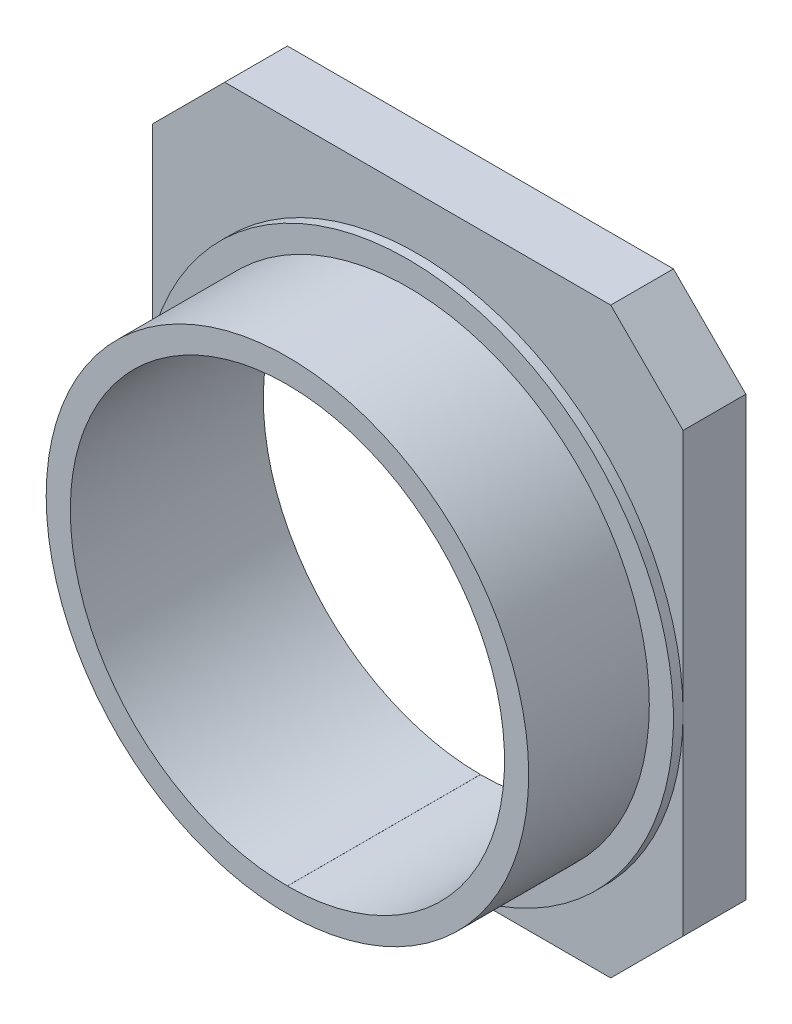
ISO-10303-21;
HEADER;
FILE_DESCRIPTION(('STEP AP214'),'2;1');
FILE_NAME('part.step','',(''),(''),'','','');
FILE_SCHEMA(('AUTOMOTIVE_DESIGN { 1 0 10303 214 1 1 1 1 }'));
ENDSEC;
DATA;
#1=APPLICATION_CONTEXT('core data for automotive mechanical design processes');
#2=APPLICATION_PROTOCOL_DEFINITION('international standard','automotive_design',2000,#1);
#3=PRODUCT_CONTEXT('',#1,'mechanical');
#4=PRODUCT('Part','Part','',(#3));
#5=PRODUCT_RELATED_PRODUCT_CATEGORY('part','',(#4));
#6=PRODUCT_DEFINITION_FORMATION('','',#4);
#7=PRODUCT_DEFINITION_CONTEXT('part definition',#1,'design');
#8=PRODUCT_DEFINITION('design','',#6,#7);
#9=PRODUCT_DEFINITION_SHAPE('','',#8);
#10=(LENGTH_UNIT() NAMED_UNIT(*) SI_UNIT(.MILLI.,.METRE.));
#11=(NAMED_UNIT(*) PLANE_ANGLE_UNIT() SI_UNIT($,.RADIAN.));
#12=(NAMED_UNIT(*) SI_UNIT($,.STERADIAN.) SOLID_ANGLE_UNIT());
#13=UNCERTAINTY_MEASURE_WITH_UNIT(LENGTH_MEASURE(1.E-05),#10,'distance_accuracy_value','');
#14=(GEOMETRIC_REPRESENTATION_CONTEXT(3) GLOBAL_UNCERTAINTY_ASSIGNED_CONTEXT((#13)) GLOBAL_UNIT_ASSIGNED_CONTEXT((#10,
#11,#12)) REPRESENTATION_CONTEXT('',''));
#15=CARTESIAN_POINT('',(0.,0.,0.));
#16=DIRECTION('',(0.,0.,1.));
#17=DIRECTION('',(1.,0.,0.));
#18=AXIS2_PLACEMENT_3D('',#15,#16,#17);
#19=CARTESIAN_POINT('',(-101.827516540233,-152.410438888243,2.99999999999968));
#20=DIRECTION('',(0.,0.,-1.));
#21=DIRECTION('',(0.,1.,0.));
#22=AXIS2_PLACEMENT_3D('',#19,#20,#21);
#23=PLANE('',#22);
#24=CARTESIAN_POINT('',(-101.827516540233,-152.410438888243,2.99999999999968));
#25=DIRECTION('',(0.,0.,-1.));
#26=DIRECTION('',(0.,1.,0.));
#27=AXIS2_PLACEMENT_3D('',#24,#25,#26);
#28=CIRCLE('',#27,11.);
#29=CARTESIAN_POINT('',(-101.827516540233,-141.410438888243,2.99999999999966));
#30=VERTEX_POINT('',#29);
#31=EDGE_CURVE('E172',#30,#30,#28,.T.);
#32=ORIENTED_EDGE('',*,*,#31,.F.);
#33=EDGE_LOOP('',(#32));
#34=FACE_BOUND('',#33,.T.);
#35=CARTESIAN_POINT('',(-101.827516540233,-152.410438888243,2.99999999999968));
#36=DIRECTION('',(0.,0.,-1.));
#37=DIRECTION('',(0.,1.,0.));
#38=AXIS2_PLACEMENT_3D('',#35,#36,#37);
#39=CIRCLE('',#38,9.99999999999998);
#40=CARTESIAN_POINT('',(-111.827516540233,-152.410438888243,2.99999999999968));
#41=VERTEX_POINT('',#40);
#42=EDGE_CURVE('E11',#41,#41,#39,.F.);
#43=ORIENTED_EDGE('',*,*,#42,.F.);
#44=EDGE_LOOP('',(#43));
#45=FACE_BOUND('',#44,.T.);
#46=ADVANCED_FACE('F34',(#34,#45),#23,.F.);
#47=CARTESIAN_POINT('',(0.,0.,2.6));
#48=DIRECTION('',(0.,0.,1.));
#49=DIRECTION('',(1.,0.,0.));
#50=AXIS2_PLACEMENT_3D('',#47,#48,#49);
#51=PLANE('',#50);
#52=CARTESIAN_POINT('',(-101.827516540233,-152.410438888243,2.6));
#53=DIRECTION('',(0.,0.,1.));
#54=DIRECTION('',(1.,0.,0.));
#55=AXIS2_PLACEMENT_3D('',#52,#53,#54);
#56=CIRCLE('',#55,11.);
#57=CARTESIAN_POINT('',(-90.8275165402331,-152.410438888243,2.6));
#58=VERTEX_POINT('',#57);
#59=CARTESIAN_POINT('',(-112.827516540233,-152.410438888243,2.6));
#60=VERTEX_POINT('',#59);
#61=EDGE_CURVE('E170',#58,#60,#56,.T.);
#62=ORIENTED_EDGE('',*,*,#61,.F.);
#63=DIRECTION('',(0.,1.,0.));
#64=VECTOR('',#63,1.);
#65=CARTESIAN_POINT('',(-90.827516540233,-160.410438888243,2.6));
#66=LINE('',#65,#64);
#67=CARTESIAN_POINT('',(-90.827516540233,-142.254588806812,2.6));
#68=VERTEX_POINT('',#67);
#69=EDGE_CURVE('E231',#58,#68,#66,.T.);
#70=ORIENTED_EDGE('',*,*,#69,.T.);
#71=DIRECTION('',(-0.707106781186551,0.707106781186544,0.));
#72=VECTOR('',#71,1.);
#73=CARTESIAN_POINT('',(-90.827516540233,-142.254588806812,2.6));
#74=LINE('',#73,#72);
#75=CARTESIAN_POINT('',(-93.827516540233,-139.254588806812,2.6));
#76=VERTEX_POINT('',#75);
#77=EDGE_CURVE('E234',#68,#76,#74,.T.);
#78=ORIENTED_EDGE('',*,*,#77,.T.);
#79=DIRECTION('',(-1.,0.,0.));
#80=VECTOR('',#79,1.);
#81=CARTESIAN_POINT('',(-93.827516540233,-139.254588806812,2.6));
#82=LINE('',#81,#80);
#83=CARTESIAN_POINT('',(-109.827516540233,-139.254588806812,2.6));
#84=VERTEX_POINT('',#83);
#85=EDGE_CURVE('E215',#76,#84,#82,.T.);
#86=ORIENTED_EDGE('',*,*,#85,.T.);
#87=DIRECTION('',(-0.707106781186547,-0.707106781186547,0.));
#88=VECTOR('',#87,1.);
#89=CARTESIAN_POINT('',(-109.827516540233,-139.254588806812,2.6));
#90=LINE('',#89,#88);
#91=CARTESIAN_POINT('',(-112.827516540233,-142.254588806812,2.6));
#92=VERTEX_POINT('',#91);
#93=EDGE_CURVE('E217',#84,#92,#90,.T.);
#94=ORIENTED_EDGE('',*,*,#93,.T.);
#95=DIRECTION('',(0.,-1.,0.));
#96=VECTOR('',#95,1.);
#97=CARTESIAN_POINT('',(-112.827516540233,-142.254588806812,2.6));
#98=LINE('',#97,#96);
#99=EDGE_CURVE('E221',#92,#60,#98,.T.);
#100=ORIENTED_EDGE('',*,*,#99,.T.);
#101=EDGE_LOOP('',(#62,#70,#78,#86,#94,#100));
#102=FACE_BOUND('',#101,.T.);
#103=ADVANCED_FACE('F319',(#102),#51,.T.);
#104=CARTESIAN_POINT('',(-101.827516540233,-163.410438888243,2.6));
#105=VERTEX_POINT('',#104);
#106=EDGE_CURVE('E42',#60,#105,#56,.T.);
#107=ORIENTED_EDGE('',*,*,#106,.F.);
#108=CARTESIAN_POINT('',(-112.827516540233,-160.410438888243,2.6));
#109=VERTEX_POINT('',#108);
#110=EDGE_CURVE('E220',#60,#109,#98,.T.);
#111=ORIENTED_EDGE('',*,*,#110,.T.);
#112=DIRECTION('',(0.707106781186551,-0.707106781186544,0.));
#113=VECTOR('',#112,1.);
#114=CARTESIAN_POINT('',(-112.827516540233,-160.410438888243,2.6));
#115=LINE('',#114,#113);
#116=CARTESIAN_POINT('',(-109.827516540233,-163.410438888243,2.6));
#117=VERTEX_POINT('',#116);
#118=EDGE_CURVE('E224',#109,#117,#115,.T.);
#119=ORIENTED_EDGE('',*,*,#118,.T.);
#120=DIRECTION('',(1.,0.,0.));
#121=VECTOR('',#120,1.);
#122=CARTESIAN_POINT('',(-109.827516540233,-163.410438888243,2.6));
#123=LINE('',#122,#121);
#124=EDGE_CURVE('E227',#117,#105,#123,.T.);
#125=ORIENTED_EDGE('',*,*,#124,.T.);
#126=EDGE_LOOP('',(#107,#111,#119,#125));
#127=FACE_BOUND('',#126,.T.);
#128=ADVANCED_FACE('F325',(#127),#51,.T.);
#129=EDGE_CURVE('E49',#105,#58,#56,.T.);
#130=ORIENTED_EDGE('',*,*,#129,.F.);
#131=CARTESIAN_POINT('',(-93.827516540233,-163.410438888243,2.6));
#132=VERTEX_POINT('',#131);
#133=EDGE_CURVE('E226',#105,#132,#123,.T.);
#134=ORIENTED_EDGE('',*,*,#133,.T.);
#135=DIRECTION('',(0.707106781186549,0.707106781186546,0.));
#136=VECTOR('',#135,1.);
#137=CARTESIAN_POINT('',(-93.827516540233,-163.410438888243,2.6));
#138=LINE('',#137,#136);
#139=CARTESIAN_POINT('',(-90.827516540233,-160.410438888243,2.6));
#140=VERTEX_POINT('',#139);
#141=EDGE_CURVE('E229',#132,#140,#138,.T.);
#142=ORIENTED_EDGE('',*,*,#141,.T.);
#143=EDGE_CURVE('E232',#140,#58,#66,.T.);
#144=ORIENTED_EDGE('',*,*,#143,.T.);
#145=EDGE_LOOP('',(#130,#134,#142,#144));
#146=FACE_BOUND('',#145,.T.);
#147=ADVANCED_FACE('F194',(#146),#51,.T.);
#148=CARTESIAN_POINT('',(0.,0.,0.));
#149=DIRECTION('',(0.,0.,1.));
#150=DIRECTION('',(1.,0.,0.));
#151=AXIS2_PLACEMENT_3D('',#148,#149,#150);
#152=PLANE('',#151);
#153=DIRECTION('',(-1.,0.,0.));
#154=VECTOR('',#153,1.);
#155=CARTESIAN_POINT('',(-101.827516540233,-139.254588806812,0.));
#156=LINE('',#155,#154);
#157=CARTESIAN_POINT('',(-93.827516540233,-139.254588806812,0.));
#158=VERTEX_POINT('',#157);
#159=CARTESIAN_POINT('',(-109.827516540233,-139.254588806812,0.));
#160=VERTEX_POINT('',#159);
#161=EDGE_CURVE('E141',#158,#160,#156,.T.);
#162=ORIENTED_EDGE('',*,*,#161,.F.);
#163=DIRECTION('',(-0.707106781186551,0.707106781186544,0.));
#164=VECTOR('',#163,1.);
#165=CARTESIAN_POINT('',(-90.827516540233,-142.254588806812,0.));
#166=LINE('',#165,#164);
#167=CARTESIAN_POINT('',(-90.827516540233,-142.254588806812,0.));
#168=VERTEX_POINT('',#167);
#169=EDGE_CURVE('E218',#168,#158,#166,.T.);
#170=ORIENTED_EDGE('',*,*,#169,.F.);
#171=DIRECTION('',(0.,1.,0.));
#172=VECTOR('',#171,1.);
#173=CARTESIAN_POINT('',(-90.827516540233,-160.410438888243,0.));
#174=LINE('',#173,#172);
#175=CARTESIAN_POINT('',(-90.827516540233,-160.410438888243,0.));
#176=VERTEX_POINT('',#175);
#177=EDGE_CURVE('E249',#176,#168,#174,.T.);
#178=ORIENTED_EDGE('',*,*,#177,.F.);
#179=DIRECTION('',(0.707106781186549,0.707106781186546,0.));
#180=VECTOR('',#179,1.);
#181=CARTESIAN_POINT('',(-93.827516540233,-163.410438888243,0.));
#182=LINE('',#181,#180);
#183=CARTESIAN_POINT('',(-93.827516540233,-163.410438888243,0.));
#184=VERTEX_POINT('',#183);
#185=EDGE_CURVE('E247',#184,#176,#182,.T.);
#186=ORIENTED_EDGE('',*,*,#185,.F.);
#187=DIRECTION('',(1.,0.,0.));
#188=VECTOR('',#187,1.);
#189=CARTESIAN_POINT('',(-101.827516540233,-163.410438888243,0.));
#190=LINE('',#189,#188);
#191=CARTESIAN_POINT('',(-109.827516540233,-163.410438888243,0.));
#192=VERTEX_POINT('',#191);
#193=EDGE_CURVE('E245',#192,#184,#190,.T.);
#194=ORIENTED_EDGE('',*,*,#193,.F.);
#195=DIRECTION('',(0.707106781186551,-0.707106781186544,0.));
#196=VECTOR('',#195,1.);
#197=CARTESIAN_POINT('',(-112.827516540233,-160.410438888243,0.));
#198=LINE('',#197,#196);
#199=CARTESIAN_POINT('',(-112.827516540233,-160.410438888243,0.));
#200=VERTEX_POINT('',#199);
#201=EDGE_CURVE('E242',#200,#192,#198,.T.);
#202=ORIENTED_EDGE('',*,*,#201,.F.);
#203=DIRECTION('',(0.,-1.,0.));
#204=VECTOR('',#203,1.);
#205=CARTESIAN_POINT('',(-112.827516540233,-142.254588806812,0.));
#206=LINE('',#205,#204);
#207=CARTESIAN_POINT('',(-112.827516540233,-142.254588806812,0.));
#208=VERTEX_POINT('',#207);
#209=EDGE_CURVE('E240',#208,#200,#206,.T.);
#210=ORIENTED_EDGE('',*,*,#209,.F.);
#211=DIRECTION('',(-0.707106781186547,-0.707106781186547,0.));
#212=VECTOR('',#211,1.);
#213=CARTESIAN_POINT('',(-109.827516540233,-139.254588806812,0.));
#214=LINE('',#213,#212);
#215=EDGE_CURVE('E238',#160,#208,#214,.T.);
#216=ORIENTED_EDGE('',*,*,#215,.F.);
#217=EDGE_LOOP('',(#162,#170,#178,#186,#194,#202,#210,#216));
#218=FACE_BOUND('',#217,.T.);
#219=CARTESIAN_POINT('',(-101.827516540233,-161.406823357677,0.));
#220=CARTESIAN_POINT('',(-102.42216227132,-161.406823357677,0.));
#221=CARTESIAN_POINT('',(-103.006870259217,-161.348469798962,0.));
#222=CARTESIAN_POINT('',(-103.869635204798,-161.176988514561,0.));
#223=CARTESIAN_POINT('',(-104.154822958599,-161.105732199917,0.));
#224=CARTESIAN_POINT('',(-104.720287744306,-160.934384241217,0.));
#225=CARTESIAN_POINT('',(-105.001330007382,-160.83380954842,0.));
#226=CARTESIAN_POINT('',(-105.81884243901,-160.494941155882,0.));
#227=CARTESIAN_POINT('',(-106.33582071987,-160.218450477253,0.));
#228=CARTESIAN_POINT('',(-107.314217621986,-159.56521514434,0.));
#229=CARTESIAN_POINT('',(-107.777447081784,-159.184998048868,0.));
#230=CARTESIAN_POINT('',(-108.607719596118,-158.354451471077,0.));
#231=CARTESIAN_POINT('',(-108.980275795572,-157.901273798026,0.));
#232=CARTESIAN_POINT('',(-109.473711648373,-157.163290180067,0.));
#233=CARTESIAN_POINT('',(-109.626905606922,-156.907604181136,0.));
#234=CARTESIAN_POINT('',(-109.904538967641,-156.387928297864,0.));
#235=CARTESIAN_POINT('',(-110.15534446231,-155.857224861545,0.));
#236=CARTESIAN_POINT('',(-110.353303759035,-155.304799076904,0.));
#237=CARTESIAN_POINT('',(-110.524479072063,-154.74136377699,0.));
#238=CARTESIAN_POINT('',(-110.596954867254,-154.452589203498,0.));
#239=CARTESIAN_POINT('',(-110.770224625138,-153.581187834757,0.));
#240=CARTESIAN_POINT('',(-110.827307978841,-152.997176094611,0.));
#241=CARTESIAN_POINT('',(-110.82761997348,-152.116665052933,0.));
#242=CARTESIAN_POINT('',(-110.813402769141,-151.822407075666,0.));
#243=CARTESIAN_POINT('',(-110.75545328208,-151.232336564079,0.));
#244=CARTESIAN_POINT('',(-110.711753861259,-150.938362019157,0.));
#245=CARTESIAN_POINT('',(-110.539397257841,-150.072608989916,0.));
#246=CARTESIAN_POINT('',(-110.369409103852,-149.511563453249,0.));
#247=CARTESIAN_POINT('',(-110.031331696858,-148.694317310471,0.));
#248=CARTESIAN_POINT('',(-109.903855236061,-148.424565493758,0.));
#249=CARTESIAN_POINT('',(-109.625080406422,-147.903123690961,0.));
#250=CARTESIAN_POINT('',(-109.473781689058,-147.650944456223,0.));
#251=CARTESIAN_POINT('',(-108.98500740176,-146.919418072436,0.));
#252=CARTESIAN_POINT('',(-108.612994328689,-146.46483797451,0.));
#253=CARTESIAN_POINT('',(-107.773025896349,-145.62447856885,0.));
#254=CARTESIAN_POINT('',(-107.3173943889,-145.251329051486,0.));
#255=CARTESIAN_POINT('',(-106.586246744701,-144.762472578704,0.));
#256=CARTESIAN_POINT('',(-106.334327243138,-144.61122512237,0.));
#257=CARTESIAN_POINT('',(-105.813734344869,-144.332634209846,0.));
#258=CARTESIAN_POINT('',(-105.543874944088,-144.204932827967,0.));
#259=CARTESIAN_POINT('',(-104.72572215151,-143.86610706214,0.));
#260=CARTESIAN_POINT('',(-104.164612328361,-143.696000900033,0.));
#261=CARTESIAN_POINT('',(-103.011425470856,-143.465984444029,0.));
#262=CARTESIAN_POINT('',(-102.414902795122,-143.407128867467,0.));
#263=CARTESIAN_POINT('',(-101.827516540233,-143.407128867467,0.));
#264=B_SPLINE_CURVE_WITH_KNOTS('',3,(#219,#220,#221,#222,#223,#224,#225,#226,#227,#228,#229,
#230,#231,#232,#233,#234,#235,#236,#237,#238,#239,#240,#241,#242,#243,#244,#245,#246,#247,#248,
#249,#250,#251,#252,#253,#254,#255,#256,#257,#258,#259,#260,#261,#262,#263),.UNSPECIFIED.,.F.,
.F.,(4,2,2,2,2,2,2,2,1,2,2,2,2,2,2,2,2,2,2,2,2,2,4),(0.,0.0625000000000002,0.0937500000000003,
0.125,0.1875,0.25,0.3125,0.34375,0.375,0.40625,0.4375,0.5,0.53125,0.5625,0.625,0.65625,0.6875,
0.75,0.8125,0.84375,0.875,0.9375,1.),.UNSPECIFIED.);
#265=CARTESIAN_POINT('',(-101.827516540233,-143.407128867467,0.));
#266=VERTEX_POINT('',#265);
#267=CARTESIAN_POINT('',(-101.827516540233,-161.406823357677,0.));
#268=VERTEX_POINT('',#267);
#269=EDGE_CURVE('E175',#266,#268,#264,.F.);
#270=ORIENTED_EDGE('',*,*,#269,.T.);
#271=DIRECTION('',(0.,-1.,0.));
#272=VECTOR('',#271,1.);
#273=CARTESIAN_POINT('',(-101.827516540233,-161.410438888243,0.));
#274=LINE('',#273,#272);
#275=CARTESIAN_POINT('',(-101.827516540233,-161.410438888243,0.));
#276=VERTEX_POINT('',#275);
#277=EDGE_CURVE('E137',#268,#276,#274,.T.);
#278=ORIENTED_EDGE('',*,*,#277,.T.);
#279=CARTESIAN_POINT('',(-101.827516540233,-152.410438888243,0.));
#280=DIRECTION('',(0.,0.,1.));
#281=DIRECTION('',(1.,0.,0.));
#282=AXIS2_PLACEMENT_3D('',#279,#280,#281);
#283=CIRCLE('',#282,9.00000000000001);
#284=CARTESIAN_POINT('',(-101.827516540233,-143.410438888243,0.));
#285=VERTEX_POINT('',#284);
#286=EDGE_CURVE('E182',#276,#285,#283,.T.);
#287=ORIENTED_EDGE('',*,*,#286,.T.);
#288=DIRECTION('',(0.,1.,0.));
#289=VECTOR('',#288,1.);
#290=CARTESIAN_POINT('',(-101.827516540233,-143.407128867467,0.));
#291=LINE('',#290,#289);
#292=EDGE_CURVE('E202',#285,#266,#291,.T.);
#293=ORIENTED_EDGE('',*,*,#292,.T.);
#294=EDGE_LOOP('',(#270,#278,#287,#293));
#295=FACE_BOUND('',#294,.T.);
#296=ADVANCED_FACE('F279',(#218,#295),#152,.F.);
#297=CARTESIAN_POINT('',(-101.827516540233,-139.254588806812,2.6));
#298=DIRECTION('',(0.,-1.,0.));
#299=DIRECTION('',(1.,0.,0.));
#300=AXIS2_PLACEMENT_3D('',#297,#298,#299);
#301=PLANE('',#300);
#302=ORIENTED_EDGE('',*,*,#161,.T.);
#303=DIRECTION('',(0.,0.,-1.));
#304=VECTOR('',#303,1.);
#305=CARTESIAN_POINT('',(-109.827516540233,-139.254588806812,2.6));
#306=LINE('',#305,#304);
#307=EDGE_CURVE('E273',#84,#160,#306,.T.);
#308=ORIENTED_EDGE('',*,*,#307,.F.);
#309=ORIENTED_EDGE('',*,*,#85,.F.);
#310=DIRECTION('',(0.,0.,-1.));
#311=VECTOR('',#310,1.);
#312=CARTESIAN_POINT('',(-93.827516540233,-139.254588806812,2.6));
#313=LINE('',#312,#311);
#314=EDGE_CURVE('E236',#76,#158,#313,.T.);
#315=ORIENTED_EDGE('',*,*,#314,.T.);
#316=EDGE_LOOP('',(#302,#308,#309,#315));
#317=FACE_BOUND('',#316,.T.);
#318=ADVANCED_FACE('F36',(#317),#301,.F.);
#319=CARTESIAN_POINT('',(-109.827516540233,-139.254588806812,2.6));
#320=DIRECTION('',(0.707106781186548,-0.707106781186548,0.));
#321=DIRECTION('',(0.707106781186548,0.707106781186548,0.));
#322=AXIS2_PLACEMENT_3D('',#319,#320,#321);
#323=PLANE('',#322);
#324=ORIENTED_EDGE('',*,*,#215,.T.);
#325=DIRECTION('',(0.,0.,-1.));
#326=VECTOR('',#325,1.);
#327=CARTESIAN_POINT('',(-112.827516540233,-142.254588806812,2.6));
#328=LINE('',#327,#326);
#329=EDGE_CURVE('E270',#92,#208,#328,.T.);
#330=ORIENTED_EDGE('',*,*,#329,.F.);
#331=ORIENTED_EDGE('',*,*,#93,.F.);
#332=ORIENTED_EDGE('',*,*,#307,.T.);
#333=EDGE_LOOP('',(#324,#330,#331,#332));
#334=FACE_BOUND('',#333,.T.);
#335=ADVANCED_FACE('F310',(#334),#323,.F.);
#336=CARTESIAN_POINT('',(-112.827516540233,-142.254588806812,2.6));
#337=DIRECTION('',(1.,0.,0.));
#338=DIRECTION('',(0.,1.,0.));
#339=AXIS2_PLACEMENT_3D('',#336,#337,#338);
#340=PLANE('',#339);
#341=ORIENTED_EDGE('',*,*,#209,.T.);
#342=DIRECTION('',(0.,0.,-1.));
#343=VECTOR('',#342,1.);
#344=CARTESIAN_POINT('',(-112.827516540233,-160.410438888243,2.6));
#345=LINE('',#344,#343);
#346=EDGE_CURVE('E267',#109,#200,#345,.T.);
#347=ORIENTED_EDGE('',*,*,#346,.F.);
#348=ORIENTED_EDGE('',*,*,#110,.F.);
#349=ORIENTED_EDGE('',*,*,#99,.F.);
#350=ORIENTED_EDGE('',*,*,#329,.T.);
#351=EDGE_LOOP('',(#341,#347,#348,#349,#350));
#352=FACE_BOUND('',#351,.T.);
#353=ADVANCED_FACE('F307',(#352),#340,.F.);
#354=CARTESIAN_POINT('',(-112.827516540233,-160.410438888243,2.6));
#355=DIRECTION('',(0.707106781186544,0.707106781186551,0.));
#356=DIRECTION('',(-0.707106781186551,0.707106781186544,0.));
#357=AXIS2_PLACEMENT_3D('',#354,#355,#356);
#358=PLANE('',#357);
#359=ORIENTED_EDGE('',*,*,#201,.T.);
#360=DIRECTION('',(0.,0.,-1.));
#361=VECTOR('',#360,1.);
#362=CARTESIAN_POINT('',(-109.827516540233,-163.410438888243,2.6));
#363=LINE('',#362,#361);
#364=EDGE_CURVE('E264',#117,#192,#363,.T.);
#365=ORIENTED_EDGE('',*,*,#364,.F.);
#366=ORIENTED_EDGE('',*,*,#118,.F.);
#367=ORIENTED_EDGE('',*,*,#346,.T.);
#368=EDGE_LOOP('',(#359,#365,#366,#367));
#369=FACE_BOUND('',#368,.T.);
#370=ADVANCED_FACE('F303',(#369),#358,.F.);
#371=CARTESIAN_POINT('',(-101.827516540233,-163.410438888243,2.6));
#372=DIRECTION('',(0.,1.,0.));
#373=DIRECTION('',(0.,0.,1.));
#374=AXIS2_PLACEMENT_3D('',#371,#372,#373);
#375=PLANE('',#374);
#376=ORIENTED_EDGE('',*,*,#193,.T.);
#377=DIRECTION('',(0.,0.,-1.));
#378=VECTOR('',#377,1.);
#379=CARTESIAN_POINT('',(-93.827516540233,-163.410438888243,2.6));
#380=LINE('',#379,#378);
#381=EDGE_CURVE('E261',#132,#184,#380,.T.);
#382=ORIENTED_EDGE('',*,*,#381,.F.);
#383=ORIENTED_EDGE('',*,*,#133,.F.);
#384=ORIENTED_EDGE('',*,*,#124,.F.);
#385=ORIENTED_EDGE('',*,*,#364,.T.);
#386=EDGE_LOOP('',(#376,#382,#383,#384,#385));
#387=FACE_BOUND('',#386,.T.);
#388=ADVANCED_FACE('F299',(#387),#375,.F.);
#389=CARTESIAN_POINT('',(-93.827516540233,-163.410438888243,2.6));
#390=DIRECTION('',(-0.707106781186546,0.707106781186549,0.));
#391=DIRECTION('',(-0.707106781186549,-0.707106781186546,0.));
#392=AXIS2_PLACEMENT_3D('',#389,#390,#391);
#393=PLANE('',#392);
#394=ORIENTED_EDGE('',*,*,#185,.T.);
#395=DIRECTION('',(0.,0.,-1.));
#396=VECTOR('',#395,1.);
#397=CARTESIAN_POINT('',(-90.827516540233,-160.410438888243,2.6));
#398=LINE('',#397,#396);
#399=EDGE_CURVE('E258',#140,#176,#398,.T.);
#400=ORIENTED_EDGE('',*,*,#399,.F.);
#401=ORIENTED_EDGE('',*,*,#141,.F.);
#402=ORIENTED_EDGE('',*,*,#381,.T.);
#403=EDGE_LOOP('',(#394,#400,#401,#402));
#404=FACE_BOUND('',#403,.T.);
#405=ADVANCED_FACE('F295',(#404),#393,.F.);
#406=CARTESIAN_POINT('',(-90.827516540233,-160.410438888243,2.6));
#407=DIRECTION('',(-1.,0.,0.));
#408=DIRECTION('',(0.,-1.,0.));
#409=AXIS2_PLACEMENT_3D('',#406,#407,#408);
#410=PLANE('',#409);
#411=ORIENTED_EDGE('',*,*,#177,.T.);
#412=DIRECTION('',(0.,0.,-1.));
#413=VECTOR('',#412,1.);
#414=CARTESIAN_POINT('',(-90.827516540233,-142.254588806812,2.6));
#415=LINE('',#414,#413);
#416=EDGE_CURVE('E255',#68,#168,#415,.T.);
#417=ORIENTED_EDGE('',*,*,#416,.F.);
#418=ORIENTED_EDGE('',*,*,#69,.F.);
#419=ORIENTED_EDGE('',*,*,#143,.F.);
#420=ORIENTED_EDGE('',*,*,#399,.T.);
#421=EDGE_LOOP('',(#411,#417,#418,#419,#420));
#422=FACE_BOUND('',#421,.T.);
#423=ADVANCED_FACE('F291',(#422),#410,.F.);
#424=CARTESIAN_POINT('',(-90.827516540233,-142.254588806812,2.6));
#425=DIRECTION('',(-0.707106781186544,-0.707106781186551,0.));
#426=DIRECTION('',(0.707106781186551,-0.707106781186544,0.));
#427=AXIS2_PLACEMENT_3D('',#424,#425,#426);
#428=PLANE('',#427);
#429=ORIENTED_EDGE('',*,*,#169,.T.);
#430=ORIENTED_EDGE('',*,*,#314,.F.);
#431=ORIENTED_EDGE('',*,*,#77,.F.);
#432=ORIENTED_EDGE('',*,*,#416,.T.);
#433=EDGE_LOOP('',(#429,#430,#431,#432));
#434=FACE_BOUND('',#433,.T.);
#435=ADVANCED_FACE('F192',(#434),#428,.F.);
#436=CARTESIAN_POINT('',(-101.827516540233,-143.407128867467,2.6));
#437=CARTESIAN_POINT('',(-102.414902795122,-143.407128867467,2.6));
#438=CARTESIAN_POINT('',(-103.011425470856,-143.465984444029,2.6));
#439=CARTESIAN_POINT('',(-104.164612328361,-143.696000900033,2.6));
#440=CARTESIAN_POINT('',(-104.72572215151,-143.86610706214,2.6));
#441=CARTESIAN_POINT('',(-105.543874944088,-144.204932827967,2.6));
#442=CARTESIAN_POINT('',(-105.813734344869,-144.332634209846,2.6));
#443=CARTESIAN_POINT('',(-106.334327243138,-144.61122512237,2.6));
#444=CARTESIAN_POINT('',(-106.586246744701,-144.762472578704,2.6));
#445=CARTESIAN_POINT('',(-107.3173943889,-145.251329051486,2.6));
#446=CARTESIAN_POINT('',(-107.773025896349,-145.62447856885,2.6));
#447=CARTESIAN_POINT('',(-108.612994328689,-146.46483797451,2.6));
#448=CARTESIAN_POINT('',(-108.98500740176,-146.919418072436,2.6));
#449=CARTESIAN_POINT('',(-109.473781689058,-147.650944456223,2.6));
#450=CARTESIAN_POINT('',(-109.625080406422,-147.903123690961,2.6));
#451=CARTESIAN_POINT('',(-109.903855236061,-148.424565493758,2.6));
#452=CARTESIAN_POINT('',(-110.031331696858,-148.694317310471,2.6));
#453=CARTESIAN_POINT('',(-110.369409103852,-149.511563453249,2.6));
#454=CARTESIAN_POINT('',(-110.539397257841,-150.072608989916,2.6));
#455=CARTESIAN_POINT('',(-110.711753861259,-150.938362019157,2.6));
#456=CARTESIAN_POINT('',(-110.75545328208,-151.232336564079,2.6));
#457=CARTESIAN_POINT('',(-110.813402769141,-151.822407075666,2.6));
#458=CARTESIAN_POINT('',(-110.82761997348,-152.116665052933,2.6));
#459=CARTESIAN_POINT('',(-110.827307978841,-152.997176094611,2.6));
#460=CARTESIAN_POINT('',(-110.770224625138,-153.581187834757,2.6));
#461=CARTESIAN_POINT('',(-110.596954867254,-154.452589203498,2.6));
#462=CARTESIAN_POINT('',(-110.524479072063,-154.74136377699,2.6));
#463=CARTESIAN_POINT('',(-110.353303759035,-155.304799076904,2.6));
#464=CARTESIAN_POINT('',(-110.15534446231,-155.857224861545,2.6));
#465=CARTESIAN_POINT('',(-109.904538967641,-156.387928297864,2.6));
#466=CARTESIAN_POINT('',(-109.626905606922,-156.907604181136,2.6));
#467=CARTESIAN_POINT('',(-109.473711648373,-157.163290180067,2.6));
#468=CARTESIAN_POINT('',(-108.980275795572,-157.901273798026,2.6));
#469=CARTESIAN_POINT('',(-108.607719596118,-158.354451471077,2.6));
#470=CARTESIAN_POINT('',(-107.777447081784,-159.184998048868,2.6));
#471=CARTESIAN_POINT('',(-107.314217621986,-159.56521514434,2.6));
#472=CARTESIAN_POINT('',(-106.33582071987,-160.218450477253,2.6));
#473=CARTESIAN_POINT('',(-105.81884243901,-160.494941155882,2.6));
#474=CARTESIAN_POINT('',(-105.001330007382,-160.83380954842,2.6));
#475=CARTESIAN_POINT('',(-104.720287744306,-160.934384241217,2.6));
#476=CARTESIAN_POINT('',(-104.154822958599,-161.105732199917,2.6));
#477=CARTESIAN_POINT('',(-103.869635204798,-161.176988514561,2.6));
#478=CARTESIAN_POINT('',(-103.006870259217,-161.348469798962,2.6));
#479=CARTESIAN_POINT('',(-102.42216227132,-161.406823357677,2.6));
#480=CARTESIAN_POINT('',(-101.827516540233,-161.406823357677,2.6));
#481=B_SPLINE_CURVE_WITH_KNOTS('',3,(#436,#437,#438,#439,#440,#441,#442,#443,#444,#445,#446,
#447,#448,#449,#450,#451,#452,#453,#454,#455,#456,#457,#458,#459,#460,#461,#462,#463,#464,#465,
#466,#467,#468,#469,#470,#471,#472,#473,#474,#475,#476,#477,#478,#479,#480),.UNSPECIFIED.,.F.,
.F.,(4,2,2,2,2,2,2,2,2,2,2,2,2,2,1,2,2,2,2,2,2,2,4),(0.,0.0624999999999999,0.125,0.15625,0.1875,
0.25,0.3125,0.34375,0.375,0.4375,0.46875,0.5,0.5625,0.59375,0.625,0.65625,0.6875,0.75,0.8125,
0.875,0.90625,0.9375,1.),.UNSPECIFIED.);
#482=DIRECTION('',(0.,0.,-1.));
#483=VECTOR('',#482,1.);
#484=SURFACE_OF_LINEAR_EXTRUSION('',#481,#483);
#485=ORIENTED_EDGE('',*,*,#269,.F.);
#486=DIRECTION('',(0.,0.,-1.));
#487=VECTOR('',#486,1.);
#488=CARTESIAN_POINT('',(-101.827516540233,-143.407128867467,2.6));
#489=LINE('',#488,#487);
#490=CARTESIAN_POINT('',(-101.827516540233,-143.407128867467,7.99999999999966));
#491=VERTEX_POINT('',#490);
#492=EDGE_CURVE('E158',#491,#266,#489,.T.);
#493=ORIENTED_EDGE('',*,*,#492,.F.);
#494=CARTESIAN_POINT('',(-101.827516540233,-143.407128867467,7.99999999999966));
#495=CARTESIAN_POINT('',(-102.414902795122,-143.407128867467,7.99999999999966));
#496=CARTESIAN_POINT('',(-103.011425470856,-143.465984444029,7.99999999999966));
#497=CARTESIAN_POINT('',(-104.164612328361,-143.696000900033,7.99999999999966));
#498=CARTESIAN_POINT('',(-104.72572215151,-143.86610706214,7.99999999999966));
#499=CARTESIAN_POINT('',(-105.543874944088,-144.204932827967,7.99999999999966));
#500=CARTESIAN_POINT('',(-105.813734344869,-144.332634209846,7.99999999999966));
#501=CARTESIAN_POINT('',(-106.334327243138,-144.61122512237,7.99999999999966));
#502=CARTESIAN_POINT('',(-106.586246744701,-144.762472578704,7.99999999999966));
#503=CARTESIAN_POINT('',(-107.3173943889,-145.251329051486,7.99999999999966));
#504=CARTESIAN_POINT('',(-107.773025896349,-145.62447856885,7.99999999999966));
#505=CARTESIAN_POINT('',(-108.612994328689,-146.46483797451,7.99999999999966));
#506=CARTESIAN_POINT('',(-108.98500740176,-146.919418072436,7.99999999999966));
#507=CARTESIAN_POINT('',(-109.473781689058,-147.650944456223,7.99999999999966));
#508=CARTESIAN_POINT('',(-109.625080406422,-147.903123690961,7.99999999999966));
#509=CARTESIAN_POINT('',(-109.903855236061,-148.424565493758,7.99999999999966));
#510=CARTESIAN_POINT('',(-110.031331696858,-148.694317310471,7.99999999999966));
#511=CARTESIAN_POINT('',(-110.369409103852,-149.511563453249,7.99999999999966));
#512=CARTESIAN_POINT('',(-110.539397257841,-150.072608989916,7.99999999999966));
#513=CARTESIAN_POINT('',(-110.711753861259,-150.938362019157,7.99999999999966));
#514=CARTESIAN_POINT('',(-110.75545328208,-151.232336564079,7.99999999999966));
#515=CARTESIAN_POINT('',(-110.813402769141,-151.822407075666,7.99999999999966));
#516=CARTESIAN_POINT('',(-110.82761997348,-152.116665052933,7.99999999999966));
#517=CARTESIAN_POINT('',(-110.827307978841,-152.997176094611,7.99999999999966));
#518=CARTESIAN_POINT('',(-110.770224625138,-153.581187834757,7.99999999999966));
#519=CARTESIAN_POINT('',(-110.596954867254,-154.452589203498,7.99999999999966));
#520=CARTESIAN_POINT('',(-110.524479072063,-154.74136377699,7.99999999999966));
#521=CARTESIAN_POINT('',(-110.353303759035,-155.304799076904,7.99999999999966));
#522=CARTESIAN_POINT('',(-110.15534446231,-155.857224861545,7.99999999999966));
#523=CARTESIAN_POINT('',(-109.904538967641,-156.387928297864,7.99999999999966));
#524=CARTESIAN_POINT('',(-109.626905606922,-156.907604181136,7.99999999999966));
#525=CARTESIAN_POINT('',(-109.473711648373,-157.163290180067,7.99999999999966));
#526=CARTESIAN_POINT('',(-108.980275795572,-157.901273798026,7.99999999999966));
#527=CARTESIAN_POINT('',(-108.607719596118,-158.354451471077,7.99999999999966));
#528=CARTESIAN_POINT('',(-107.777447081784,-159.184998048868,7.99999999999966));
#529=CARTESIAN_POINT('',(-107.314217621986,-159.56521514434,7.99999999999966));
#530=CARTESIAN_POINT('',(-106.33582071987,-160.218450477253,7.99999999999966));
#531=CARTESIAN_POINT('',(-105.81884243901,-160.494941155882,7.99999999999966));
#532=CARTESIAN_POINT('',(-105.001330007382,-160.83380954842,7.99999999999966));
#533=CARTESIAN_POINT('',(-104.720287744306,-160.934384241217,7.99999999999966));
#534=CARTESIAN_POINT('',(-104.154822958599,-161.105732199917,7.99999999999966));
#535=CARTESIAN_POINT('',(-103.869635204798,-161.176988514561,7.99999999999966));
#536=CARTESIAN_POINT('',(-103.006870259217,-161.348469798962,7.99999999999966));
#537=CARTESIAN_POINT('',(-102.42216227132,-161.406823357677,7.99999999999966));
#538=CARTESIAN_POINT('',(-101.827516540233,-161.406823357677,7.99999999999966));
#539=B_SPLINE_CURVE_WITH_KNOTS('',3,(#494,#495,#496,#497,#498,#499,#500,#501,#502,#503,#504,
#505,#506,#507,#508,#509,#510,#511,#512,#513,#514,#515,#516,#517,#518,#519,#520,#521,#522,#523,
#524,#525,#526,#527,#528,#529,#530,#531,#532,#533,#534,#535,#536,#537,#538),.UNSPECIFIED.,.F.,
.F.,(4,2,2,2,2,2,2,2,2,2,2,2,2,2,1,2,2,2,2,2,2,2,4),(0.,0.0624999999999999,0.125,0.15625,0.1875,
0.25,0.3125,0.34375,0.375,0.4375,0.46875,0.5,0.5625,0.59375,0.625,0.65625,0.6875,0.75,0.8125,
0.875,0.90625,0.9375,1.),.UNSPECIFIED.);
#540=CARTESIAN_POINT('',(-101.827516540233,-161.406823357677,7.99999999999966));
#541=VERTEX_POINT('',#540);
#542=EDGE_CURVE('E150',#491,#541,#539,.T.);
#543=ORIENTED_EDGE('',*,*,#542,.T.);
#544=DIRECTION('',(0.,0.,-1.));
#545=VECTOR('',#544,1.);
#546=CARTESIAN_POINT('',(-101.827516540233,-161.406823357677,2.6));
#547=LINE('',#546,#545);
#548=EDGE_CURVE('E132',#541,#268,#547,.T.);
#549=ORIENTED_EDGE('',*,*,#548,.T.);
#550=EDGE_LOOP('',(#485,#493,#543,#549));
#551=FACE_BOUND('',#550,.T.);
#552=ADVANCED_FACE('F156',(#551),#484,.T.);
#553=CARTESIAN_POINT('',(-101.827516540233,-161.410438888243,2.6));
#554=DIRECTION('',(1.,0.,0.));
#555=DIRECTION('',(0.,0.,-1.));
#556=AXIS2_PLACEMENT_3D('',#553,#554,#555);
#557=PLANE('',#556);
#558=ORIENTED_EDGE('',*,*,#277,.F.);
#559=ORIENTED_EDGE('',*,*,#548,.F.);
#560=DIRECTION('',(0.,-1.,0.));
#561=VECTOR('',#560,1.);
#562=CARTESIAN_POINT('',(-101.827516540233,-161.406823357677,7.99999999999966));
#563=LINE('',#562,#561);
#564=CARTESIAN_POINT('',(-101.827516540233,-161.410438888243,7.99999999999966));
#565=VERTEX_POINT('',#564);
#566=EDGE_CURVE('E135',#541,#565,#563,.T.);
#567=ORIENTED_EDGE('',*,*,#566,.T.);
#568=DIRECTION('',(0.,0.,-1.));
#569=VECTOR('',#568,1.);
#570=CARTESIAN_POINT('',(-101.827516540233,-161.410438888243,2.6));
#571=LINE('',#570,#569);
#572=EDGE_CURVE('E142',#565,#276,#571,.T.);
#573=ORIENTED_EDGE('',*,*,#572,.T.);
#574=EDGE_LOOP('',(#558,#559,#567,#573));
#575=FACE_BOUND('',#574,.T.);
#576=ADVANCED_FACE('F134',(#575),#557,.T.);
#577=CARTESIAN_POINT('',(-101.827516540233,-152.410438888243,2.6));
#578=DIRECTION('',(0.,0.,-1.));
#579=DIRECTION('',(-1.,0.,0.));
#580=AXIS2_PLACEMENT_3D('',#577,#578,#579);
#581=CYLINDRICAL_SURFACE('',#580,9.00000000000001);
#582=ORIENTED_EDGE('',*,*,#286,.F.);
#583=ORIENTED_EDGE('',*,*,#572,.F.);
#584=CARTESIAN_POINT('',(-101.827516540233,-152.410438888243,7.99999999999964));
#585=DIRECTION('',(0.,0.,1.));
#586=DIRECTION('',(0.,-1.,0.));
#587=AXIS2_PLACEMENT_3D('',#584,#585,#586);
#588=CIRCLE('',#587,8.99999999999998);
#589=CARTESIAN_POINT('',(-101.827516540233,-143.410438888243,7.99999999999963));
#590=VERTEX_POINT('',#589);
#591=EDGE_CURVE('E153',#565,#590,#588,.T.);
#592=ORIENTED_EDGE('',*,*,#591,.T.);
#593=DIRECTION('',(0.,0.,-1.));
#594=VECTOR('',#593,1.);
#595=CARTESIAN_POINT('',(-101.827516540233,-143.410438888243,2.6));
#596=LINE('',#595,#594);
#597=EDGE_CURVE('E348',#590,#285,#596,.T.);
#598=ORIENTED_EDGE('',*,*,#597,.T.);
#599=EDGE_LOOP('',(#582,#583,#592,#598));
#600=FACE_BOUND('',#599,.T.);
#601=ADVANCED_FACE('F339',(#600),#581,.F.);
#602=CARTESIAN_POINT('',(-101.827516540233,-143.407128867467,2.6));
#603=DIRECTION('',(-1.,0.,0.));
#604=DIRECTION('',(0.,0.,1.));
#605=AXIS2_PLACEMENT_3D('',#602,#603,#604);
#606=PLANE('',#605);
#607=ORIENTED_EDGE('',*,*,#292,.F.);
#608=ORIENTED_EDGE('',*,*,#597,.F.);
#609=DIRECTION('',(4.19265882164008E-12,1.,0.));
#610=VECTOR('',#609,1.);
#611=CARTESIAN_POINT('',(-101.827516540233,-143.410438888243,7.99999999999963));
#612=LINE('',#611,#610);
#613=EDGE_CURVE('E159',#590,#491,#612,.T.);
#614=ORIENTED_EDGE('',*,*,#613,.T.);
#615=ORIENTED_EDGE('',*,*,#492,.T.);
#616=EDGE_LOOP('',(#607,#608,#614,#615));
#617=FACE_BOUND('',#616,.T.);
#618=ADVANCED_FACE('F336',(#617),#606,.T.);
#619=CARTESIAN_POINT('',(-101.827516540233,-152.410438888243,-28.512698372208));
#620=DIRECTION('',(0.,0.,1.));
#621=DIRECTION('',(0.,-1.,0.));
#622=AXIS2_PLACEMENT_3D('',#619,#620,#621);
#623=CYLINDRICAL_SURFACE('',#622,11.);
#624=ORIENTED_EDGE('',*,*,#61,.T.);
#625=ORIENTED_EDGE('',*,*,#106,.T.);
#626=ORIENTED_EDGE('',*,*,#129,.T.);
#627=EDGE_LOOP('',(#624,#625,#626));
#628=FACE_BOUND('',#627,.T.);
#629=ORIENTED_EDGE('',*,*,#31,.T.);
#630=EDGE_LOOP('',(#629));
#631=FACE_BOUND('',#630,.T.);
#632=ADVANCED_FACE('F333',(#628,#631),#623,.T.);
#633=CARTESIAN_POINT('',(-101.827516540233,-152.410438888243,36.2842712474615));
#634=DIRECTION('',(0.,0.,-1.));
#635=DIRECTION('',(-1.,0.,0.));
#636=AXIS2_PLACEMENT_3D('',#633,#634,#635);
#637=CYLINDRICAL_SURFACE('',#636,9.99999999999998);
#638=CARTESIAN_POINT('',(-101.827516540233,-152.410438888243,7.99999999999964));
#639=DIRECTION('',(0.,0.,1.));
#640=DIRECTION('',(0.,-1.,0.));
#641=AXIS2_PLACEMENT_3D('',#638,#639,#640);
#642=CIRCLE('',#641,9.99999999999998);
#643=CARTESIAN_POINT('',(-111.827516540233,-152.410438888243,7.99999999999964));
#644=VERTEX_POINT('',#643);
#645=EDGE_CURVE('E154',#644,#644,#642,.T.);
#646=CARTESIAN_POINT('',(-111.827516540233,-152.410438888243,2.99999999999968));
#647=CARTESIAN_POINT('',(-111.827516540233,-152.410438888243,3.05208333333301));
#648=CARTESIAN_POINT('',(-111.827516540233,-152.410438888243,3.10416666666634));
#649=CARTESIAN_POINT('',(-111.827516540233,-152.410438888243,3.20833333333301));
#650=CARTESIAN_POINT('',(-111.827516540233,-152.410438888243,3.26041666666634));
#651=CARTESIAN_POINT('',(-111.827516540233,-152.410438888243,3.36458333333301));
#652=CARTESIAN_POINT('',(-111.827516540233,-152.410438888243,3.41666666666634));
#653=CARTESIAN_POINT('',(-111.827516540233,-152.410438888243,3.52083333333301));
#654=CARTESIAN_POINT('',(-111.827516540233,-152.410438888243,3.57291666666634));
#655=CARTESIAN_POINT('',(-111.827516540233,-152.410438888243,3.677083333333));
#656=CARTESIAN_POINT('',(-111.827516540233,-152.410438888243,3.72916666666634));
#657=CARTESIAN_POINT('',(-111.827516540233,-152.410438888243,3.83333333333301));
#658=CARTESIAN_POINT('',(-111.827516540233,-152.410438888243,3.88541666666634));
#659=CARTESIAN_POINT('',(-111.827516540233,-152.410438888243,3.989583333333));
#660=CARTESIAN_POINT('',(-111.827516540233,-152.410438888243,4.04166666666633));
#661=CARTESIAN_POINT('',(-111.827516540233,-152.410438888243,4.145833333333));
#662=CARTESIAN_POINT('',(-111.827516540233,-152.410438888243,4.19791666666634));
#663=CARTESIAN_POINT('',(-111.827516540233,-152.410438888243,4.302083333333));
#664=CARTESIAN_POINT('',(-111.827516540233,-152.410438888243,4.35416666666634));
#665=CARTESIAN_POINT('',(-111.827516540233,-152.410438888243,4.458333333333));
#666=CARTESIAN_POINT('',(-111.827516540233,-152.410438888243,4.51041666666633));
#667=CARTESIAN_POINT('',(-111.827516540233,-152.410438888243,4.614583333333));
#668=CARTESIAN_POINT('',(-111.827516540233,-152.410438888243,4.66666666666633));
#669=CARTESIAN_POINT('',(-111.827516540233,-152.410438888243,4.770833333333));
#670=CARTESIAN_POINT('',(-111.827516540233,-152.410438888243,4.82291666666633));
#671=CARTESIAN_POINT('',(-111.827516540233,-152.410438888243,4.927083333333));
#672=CARTESIAN_POINT('',(-111.827516540233,-152.410438888243,4.97916666666633));
#673=CARTESIAN_POINT('',(-111.827516540233,-152.410438888243,5.08333333333299));
#674=CARTESIAN_POINT('',(-111.827516540233,-152.410438888243,5.13541666666633));
#675=CARTESIAN_POINT('',(-111.827516540233,-152.410438888243,5.23958333333299));
#676=CARTESIAN_POINT('',(-111.827516540233,-152.410438888243,5.29166666666633));
#677=CARTESIAN_POINT('',(-111.827516540233,-152.410438888243,5.39583333333299));
#678=CARTESIAN_POINT('',(-111.827516540233,-152.410438888243,5.44791666666632));
#679=CARTESIAN_POINT('',(-111.827516540233,-152.410438888243,5.55208333333299));
#680=CARTESIAN_POINT('',(-111.827516540233,-152.410438888243,5.60416666666632));
#681=CARTESIAN_POINT('',(-111.827516540233,-152.410438888243,5.70833333333299));
#682=CARTESIAN_POINT('',(-111.827516540233,-152.410438888243,5.76041666666632));
#683=CARTESIAN_POINT('',(-111.827516540233,-152.410438888243,5.86458333333299));
#684=CARTESIAN_POINT('',(-111.827516540233,-152.410438888243,5.91666666666632));
#685=CARTESIAN_POINT('',(-111.827516540233,-152.410438888243,6.02083333333299));
#686=CARTESIAN_POINT('',(-111.827516540233,-152.410438888243,6.07291666666632));
#687=CARTESIAN_POINT('',(-111.827516540233,-152.410438888243,6.17708333333299));
#688=CARTESIAN_POINT('',(-111.827516540233,-152.410438888243,6.22916666666632));
#689=CARTESIAN_POINT('',(-111.827516540233,-152.410438888243,6.33333333333299));
#690=CARTESIAN_POINT('',(-111.827516540233,-152.410438888243,6.38541666666632));
#691=CARTESIAN_POINT('',(-111.827516540233,-152.410438888243,6.48958333333299));
#692=CARTESIAN_POINT('',(-111.827516540233,-152.410438888243,6.54166666666632));
#693=CARTESIAN_POINT('',(-111.827516540233,-152.410438888243,6.64583333333298));
#694=CARTESIAN_POINT('',(-111.827516540233,-152.410438888243,6.69791666666632));
#695=CARTESIAN_POINT('',(-111.827516540233,-152.410438888243,6.80208333333298));
#696=CARTESIAN_POINT('',(-111.827516540233,-152.410438888243,6.85416666666632));
#697=CARTESIAN_POINT('',(-111.827516540233,-152.410438888243,6.95833333333298));
#698=CARTESIAN_POINT('',(-111.827516540233,-152.410438888243,7.01041666666632));
#699=CARTESIAN_POINT('',(-111.827516540233,-152.410438888243,7.11458333333298));
#700=CARTESIAN_POINT('',(-111.827516540233,-152.410438888243,7.16666666666631));
#701=CARTESIAN_POINT('',(-111.827516540233,-152.410438888243,7.27083333333298));
#702=CARTESIAN_POINT('',(-111.827516540233,-152.410438888243,7.32291666666631));
#703=CARTESIAN_POINT('',(-111.827516540233,-152.410438888243,7.42708333333298));
#704=CARTESIAN_POINT('',(-111.827516540233,-152.410438888243,7.47916666666631));
#705=CARTESIAN_POINT('',(-111.827516540233,-152.410438888243,7.58333333333298));
#706=CARTESIAN_POINT('',(-111.827516540233,-152.410438888243,7.63541666666631));
#707=CARTESIAN_POINT('',(-111.827516540233,-152.410438888243,7.73958333333298));
#708=CARTESIAN_POINT('',(-111.827516540233,-152.410438888243,7.79166666666631));
#709=CARTESIAN_POINT('',(-111.827516540233,-152.410438888243,7.89583333333298));
#710=CARTESIAN_POINT('',(-111.827516540233,-152.410438888243,7.94791666666631));
#711=CARTESIAN_POINT('',(-111.827516540233,-152.410438888243,7.99999999999964));
#712=B_SPLINE_CURVE_WITH_KNOTS('',3,(#646,#647,#648,#649,#650,#651,#652,#653,#654,#655,#656,
#657,#658,#659,#660,#661,#662,#663,#664,#665,#666,#667,#668,#669,#670,#671,#672,#673,#674,#675,
#676,#677,#678,#679,#680,#681,#682,#683,#684,#685,#686,#687,#688,#689,#690,#691,#692,#693,#694,
#695,#696,#697,#698,#699,#700,#701,#702,#703,#704,#705,#706,#707,#708,#709,#710,#711),
.UNSPECIFIED.,.F.,.F.,(4,2,2,2,2,2,2,2,2,2,2,2,2,2,2,2,2,2,2,2,2,2,2,2,2,2,2,2,2,2,2,2,4),(0.,
0.156249999999997,0.3125,0.468749999999997,0.624999999999994,0.781249999999997,
0.937499999999994,1.09374999999999,1.24999999999999,1.40624999999999,1.56249999999999,
1.71874999999999,1.87499999999999,2.03124999999998,2.18749999999998,2.34374999999998,
2.49999999999998,2.65624999999998,2.81249999999998,2.96874999999998,3.12499999999998,
3.28124999999998,3.43749999999998,3.59374999999998,3.74999999999997,3.90624999999997,
4.06249999999997,4.21874999999997,4.37499999999997,4.53124999999997,4.68749999999997,
4.84374999999997,4.99999999999997),.UNSPECIFIED.);
#713=EDGE_CURVE('BSEAM331',#41,#644,#712,.T.);
#714=ORIENTED_EDGE('',*,*,#42,.T.);
#715=ORIENTED_EDGE('',*,*,#645,.F.);
#716=ORIENTED_EDGE('',*,*,#713,.T.);
#717=ORIENTED_EDGE('',*,*,#713,.F.);
#718=EDGE_LOOP('',(#714,#716,#715,#717));
#719=FACE_BOUND('',#718,.T.);
#720=ADVANCED_FACE('F331',(#719),#637,.T.);
#721=CARTESIAN_POINT('',(-113.247430997046,-162.973845242215,7.99999999999966));
#722=DIRECTION('',(0.,0.,1.));
#723=DIRECTION('',(-0.999241855035571,0.0389321864922843,0.));
#724=AXIS2_PLACEMENT_3D('',#721,#722,#723);
#725=PLANE('',#724);
#726=ORIENTED_EDGE('',*,*,#591,.F.);
#727=ORIENTED_EDGE('',*,*,#566,.F.);
#728=ORIENTED_EDGE('',*,*,#542,.F.);
#729=ORIENTED_EDGE('',*,*,#613,.F.);
#730=EDGE_LOOP('',(#726,#727,#728,#729));
#731=FACE_BOUND('',#730,.T.);
#732=ORIENTED_EDGE('',*,*,#645,.T.);
#733=EDGE_LOOP('',(#732));
#734=FACE_BOUND('',#733,.T.);
#735=ADVANCED_FACE('F147',(#731,#734),#725,.T.);
#736=CLOSED_SHELL('',(#46,#103,#128,#147,#296,#318,#335,#353,#370,#388,#405,#423,#435,#552,#576,
#601,#618,#632,#720,#735));
#737=MANIFOLD_SOLID_BREP('B2',#736);
#738=ADVANCED_BREP_SHAPE_REPRESENTATION('',(#18,#737),#14);
#739=SHAPE_DEFINITION_REPRESENTATION(#9,#738);
ENDSEC;
END-ISO-10303-21;
